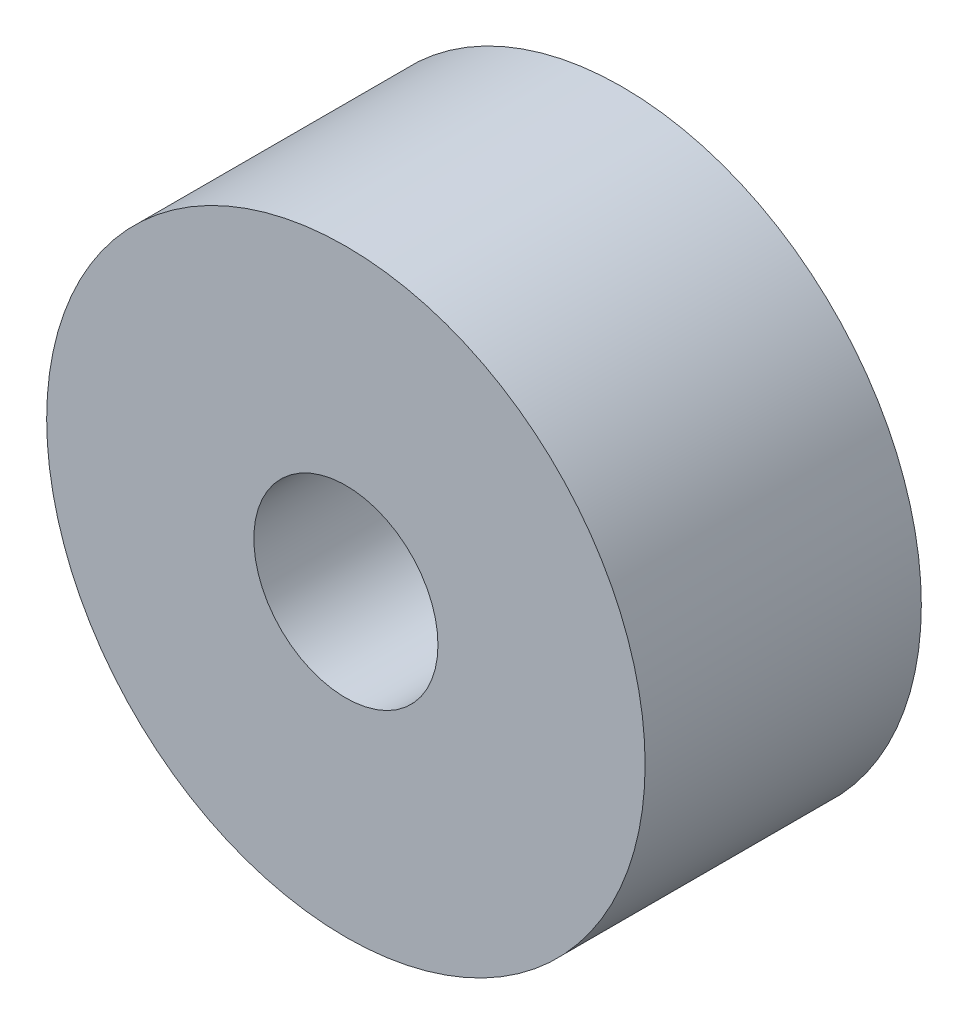
ISO-10303-21;
HEADER;
FILE_DESCRIPTION(('STEP AP214'),'2;1');
FILE_NAME('part.step','',(''),(''),'','','');
FILE_SCHEMA(('AUTOMOTIVE_DESIGN { 1 0 10303 214 1 1 1 1 }'));
ENDSEC;
DATA;
#1=APPLICATION_CONTEXT('core data for automotive mechanical design processes');
#2=APPLICATION_PROTOCOL_DEFINITION('international standard','automotive_design',2000,#1);
#3=PRODUCT_CONTEXT('',#1,'mechanical');
#4=PRODUCT('Part','Part','',(#3));
#5=PRODUCT_RELATED_PRODUCT_CATEGORY('part','',(#4));
#6=PRODUCT_DEFINITION_FORMATION('','',#4);
#7=PRODUCT_DEFINITION_CONTEXT('part definition',#1,'design');
#8=PRODUCT_DEFINITION('design','',#6,#7);
#9=PRODUCT_DEFINITION_SHAPE('','',#8);
#10=(LENGTH_UNIT() NAMED_UNIT(*) SI_UNIT(.MILLI.,.METRE.));
#11=(NAMED_UNIT(*) PLANE_ANGLE_UNIT() SI_UNIT($,.RADIAN.));
#12=(NAMED_UNIT(*) SI_UNIT($,.STERADIAN.) SOLID_ANGLE_UNIT());
#13=UNCERTAINTY_MEASURE_WITH_UNIT(LENGTH_MEASURE(1.E-05),#10,'distance_accuracy_value','');
#14=(GEOMETRIC_REPRESENTATION_CONTEXT(3) GLOBAL_UNCERTAINTY_ASSIGNED_CONTEXT((#13)) GLOBAL_UNIT_ASSIGNED_CONTEXT((#10,
#11,#12)) REPRESENTATION_CONTEXT('',''));
#15=CARTESIAN_POINT('',(0.,0.,0.));
#16=DIRECTION('',(0.,0.,1.));
#17=DIRECTION('',(1.,0.,0.));
#18=AXIS2_PLACEMENT_3D('',#15,#16,#17);
#19=CARTESIAN_POINT('',(0.,0.,6.));
#20=DIRECTION('',(0.,0.,-1.));
#21=DIRECTION('',(-1.,0.,0.));
#22=AXIS2_PLACEMENT_3D('',#19,#20,#21);
#23=CYLINDRICAL_SURFACE('',#22,6.5);
#24=CARTESIAN_POINT('',(0.,0.,6.));
#25=DIRECTION('',(0.,0.,1.));
#26=DIRECTION('',(1.,0.,0.));
#27=AXIS2_PLACEMENT_3D('',#24,#25,#26);
#28=CIRCLE('',#27,6.5);
#29=CARTESIAN_POINT('',(6.5,0.,6.));
#30=VERTEX_POINT('',#29);
#31=EDGE_CURVE('E10',#30,#30,#28,.T.);
#32=ORIENTED_EDGE('',*,*,#31,.F.);
#33=EDGE_LOOP('',(#32));
#34=FACE_BOUND('',#33,.T.);
#35=CARTESIAN_POINT('',(0.,0.,0.));
#36=DIRECTION('',(0.,0.,1.));
#37=DIRECTION('',(1.,0.,0.));
#38=AXIS2_PLACEMENT_3D('',#35,#36,#37);
#39=CIRCLE('',#38,6.5);
#40=CARTESIAN_POINT('',(6.5,0.,0.));
#41=VERTEX_POINT('',#40);
#42=EDGE_CURVE('E42',#41,#41,#39,.T.);
#43=ORIENTED_EDGE('',*,*,#42,.T.);
#44=EDGE_LOOP('',(#43));
#45=FACE_BOUND('',#44,.T.);
#46=ADVANCED_FACE('F39',(#34,#45),#23,.T.);
#47=CARTESIAN_POINT('',(0.,0.,6.));
#48=DIRECTION('',(0.,0.,1.));
#49=DIRECTION('',(1.,0.,0.));
#50=AXIS2_PLACEMENT_3D('',#47,#48,#49);
#51=PLANE('',#50);
#52=CARTESIAN_POINT('',(0.,0.,6.));
#53=DIRECTION('',(0.,0.,1.));
#54=DIRECTION('',(1.,0.,0.));
#55=AXIS2_PLACEMENT_3D('',#52,#53,#54);
#56=CIRCLE('',#55,2.);
#57=CARTESIAN_POINT('',(2.,0.,6.));
#58=VERTEX_POINT('',#57);
#59=EDGE_CURVE('E51',#58,#58,#56,.T.);
#60=ORIENTED_EDGE('',*,*,#59,.F.);
#61=EDGE_LOOP('',(#60));
#62=FACE_BOUND('',#61,.T.);
#63=ORIENTED_EDGE('',*,*,#31,.T.);
#64=EDGE_LOOP('',(#63));
#65=FACE_BOUND('',#64,.T.);
#66=ADVANCED_FACE('F66',(#62,#65),#51,.T.);
#67=CARTESIAN_POINT('',(0.,0.,0.));
#68=DIRECTION('',(0.,0.,1.));
#69=DIRECTION('',(1.,0.,0.));
#70=AXIS2_PLACEMENT_3D('',#67,#68,#69);
#71=PLANE('',#70);
#72=CARTESIAN_POINT('',(0.,0.,0.));
#73=DIRECTION('',(0.,0.,1.));
#74=DIRECTION('',(1.,0.,0.));
#75=AXIS2_PLACEMENT_3D('',#72,#73,#74);
#76=CIRCLE('',#75,2.);
#77=CARTESIAN_POINT('',(2.,0.,0.));
#78=VERTEX_POINT('',#77);
#79=EDGE_CURVE('E49',#78,#78,#76,.T.);
#80=ORIENTED_EDGE('',*,*,#79,.T.);
#81=EDGE_LOOP('',(#80));
#82=FACE_BOUND('',#81,.T.);
#83=ORIENTED_EDGE('',*,*,#42,.F.);
#84=EDGE_LOOP('',(#83));
#85=FACE_BOUND('',#84,.T.);
#86=ADVANCED_FACE('F57',(#82,#85),#71,.F.);
#87=CARTESIAN_POINT('',(0.,0.,0.));
#88=DIRECTION('',(0.,0.,1.));
#89=DIRECTION('',(1.,0.,0.));
#90=AXIS2_PLACEMENT_3D('',#87,#88,#89);
#91=CYLINDRICAL_SURFACE('',#90,2.);
#92=ORIENTED_EDGE('',*,*,#79,.F.);
#93=EDGE_LOOP('',(#92));
#94=FACE_BOUND('',#93,.T.);
#95=ORIENTED_EDGE('',*,*,#59,.T.);
#96=EDGE_LOOP('',(#95));
#97=FACE_BOUND('',#96,.T.);
#98=ADVANCED_FACE('F60',(#94,#97),#91,.F.);
#99=CLOSED_SHELL('',(#46,#66,#86,#98));
#100=MANIFOLD_SOLID_BREP('B2',#99);
#101=ADVANCED_BREP_SHAPE_REPRESENTATION('',(#18,#100),#14);
#102=SHAPE_DEFINITION_REPRESENTATION(#9,#101);
ENDSEC;
END-ISO-10303-21;
